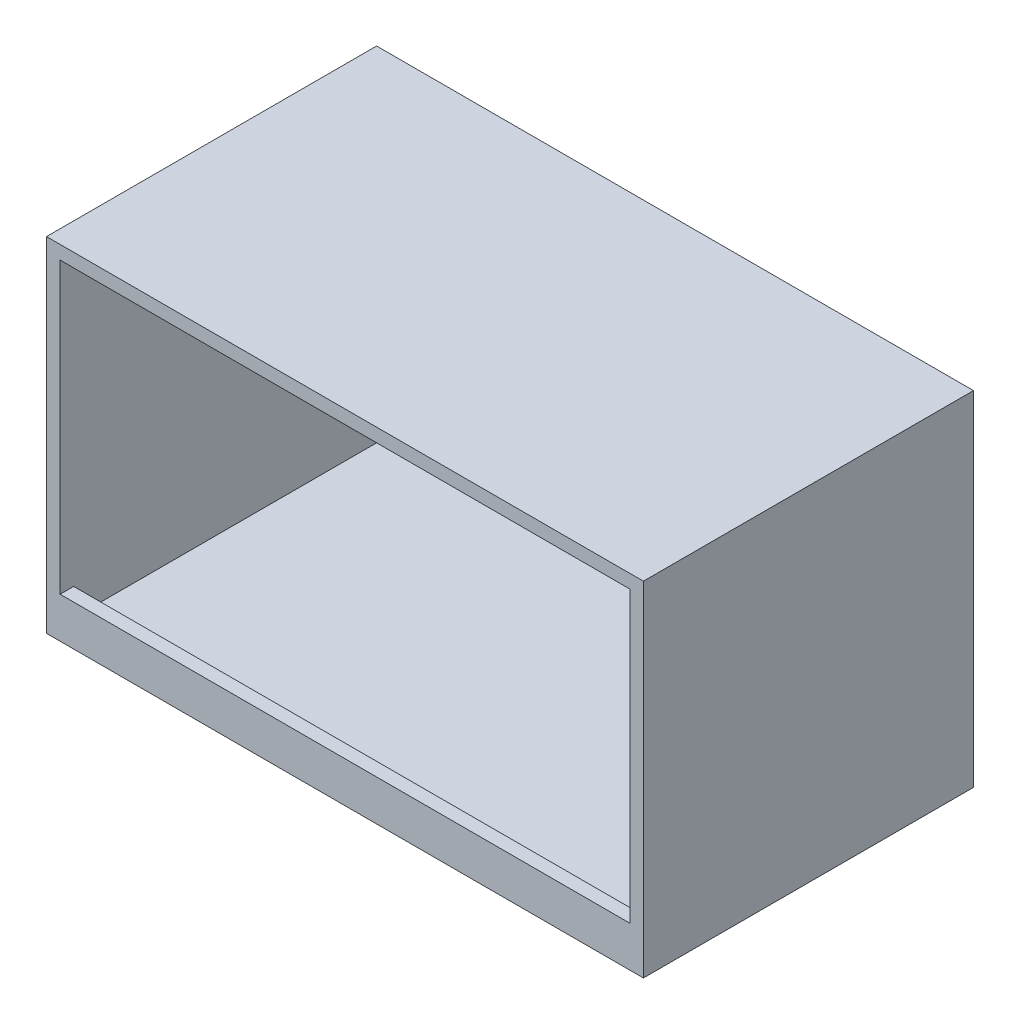
ISO-10303-21;
HEADER;
FILE_DESCRIPTION(('STEP AP214'),'2;1');
FILE_NAME('part.step','',(''),(''),'','','');
FILE_SCHEMA(('AUTOMOTIVE_DESIGN { 1 0 10303 214 1 1 1 1 }'));
ENDSEC;
DATA;
#1=APPLICATION_CONTEXT('core data for automotive mechanical design processes');
#2=APPLICATION_PROTOCOL_DEFINITION('international standard','automotive_design',2000,#1);
#3=PRODUCT_CONTEXT('',#1,'mechanical');
#4=PRODUCT('Part','Part','',(#3));
#5=PRODUCT_RELATED_PRODUCT_CATEGORY('part','',(#4));
#6=PRODUCT_DEFINITION_FORMATION('','',#4);
#7=PRODUCT_DEFINITION_CONTEXT('part definition',#1,'design');
#8=PRODUCT_DEFINITION('design','',#6,#7);
#9=PRODUCT_DEFINITION_SHAPE('','',#8);
#10=(LENGTH_UNIT() NAMED_UNIT(*) SI_UNIT(.MILLI.,.METRE.));
#11=(NAMED_UNIT(*) PLANE_ANGLE_UNIT() SI_UNIT($,.RADIAN.));
#12=(NAMED_UNIT(*) SI_UNIT($,.STERADIAN.) SOLID_ANGLE_UNIT());
#13=UNCERTAINTY_MEASURE_WITH_UNIT(LENGTH_MEASURE(1.E-05),#10,'distance_accuracy_value','');
#14=(GEOMETRIC_REPRESENTATION_CONTEXT(3) GLOBAL_UNCERTAINTY_ASSIGNED_CONTEXT((#13)) GLOBAL_UNIT_ASSIGNED_CONTEXT((#10,
#11,#12)) REPRESENTATION_CONTEXT('',''));
#15=CARTESIAN_POINT('',(0.,0.,0.));
#16=DIRECTION('',(0.,0.,1.));
#17=DIRECTION('',(1.,0.,0.));
#18=AXIS2_PLACEMENT_3D('',#15,#16,#17);
#19=CARTESIAN_POINT('',(64.5,-36.5,36.5));
#20=DIRECTION('',(0.,1.,0.));
#21=DIRECTION('',(-1.,0.,0.));
#22=AXIS2_PLACEMENT_3D('',#19,#20,#21);
#23=PLANE('',#22);
#24=DIRECTION('',(0.,0.,-1.));
#25=VECTOR('',#24,1.);
#26=CARTESIAN_POINT('',(1.5,-36.5,36.5));
#27=LINE('',#26,#25);
#28=CARTESIAN_POINT('',(1.5,-36.5,32.));
#29=VERTEX_POINT('',#28);
#30=CARTESIAN_POINT('',(1.5,-36.5,1.5));
#31=VERTEX_POINT('',#30);
#32=EDGE_CURVE('E134',#29,#31,#27,.T.);
#33=ORIENTED_EDGE('',*,*,#32,.F.);
#34=DIRECTION('',(-1.,0.,0.));
#35=VECTOR('',#34,1.);
#36=CARTESIAN_POINT('',(64.5,-36.5,32.));
#37=LINE('',#36,#35);
#38=CARTESIAN_POINT('',(64.5,-36.5,32.));
#39=VERTEX_POINT('',#38);
#40=EDGE_CURVE('E43',#29,#39,#37,.F.);
#41=ORIENTED_EDGE('',*,*,#40,.T.);
#42=DIRECTION('',(0.,0.,-1.));
#43=VECTOR('',#42,1.);
#44=CARTESIAN_POINT('',(64.5,-36.5,36.5));
#45=LINE('',#44,#43);
#46=CARTESIAN_POINT('',(64.5,-36.5,1.5));
#47=VERTEX_POINT('',#46);
#48=EDGE_CURVE('E155',#39,#47,#45,.T.);
#49=ORIENTED_EDGE('',*,*,#48,.T.);
#50=DIRECTION('',(1.,0.,0.));
#51=VECTOR('',#50,1.);
#52=CARTESIAN_POINT('',(64.5,-36.5,1.5));
#53=LINE('',#52,#51);
#54=EDGE_CURVE('E141',#31,#47,#53,.T.);
#55=ORIENTED_EDGE('',*,*,#54,.F.);
#56=EDGE_LOOP('',(#33,#41,#49,#55));
#57=FACE_BOUND('',#56,.T.);
#58=ADVANCED_FACE('F35',(#57),#23,.T.);
#59=CARTESIAN_POINT('',(64.5,-36.5,36.5));
#60=DIRECTION('',(-1.,0.,0.));
#61=DIRECTION('',(0.,0.,1.));
#62=AXIS2_PLACEMENT_3D('',#59,#60,#61);
#63=PLANE('',#62);
#64=ORIENTED_EDGE('',*,*,#48,.F.);
#65=CARTESIAN_POINT('',(64.5,-33.5,32.));
#66=DIRECTION('',(-1.,0.,0.));
#67=DIRECTION('',(0.,0.,1.));
#68=AXIS2_PLACEMENT_3D('',#65,#66,#67);
#69=CIRCLE('',#68,3.);
#70=CARTESIAN_POINT('',(64.5,-33.5,35.));
#71=VERTEX_POINT('',#70);
#72=EDGE_CURVE('E11',#39,#71,#69,.T.);
#73=ORIENTED_EDGE('',*,*,#72,.T.);
#74=DIRECTION('',(0.,0.,-1.));
#75=VECTOR('',#74,1.);
#76=CARTESIAN_POINT('',(64.5,-33.5,36.5));
#77=LINE('',#76,#75);
#78=CARTESIAN_POINT('',(64.5,-33.5,36.5));
#79=VERTEX_POINT('',#78);
#80=EDGE_CURVE('E121',#79,#71,#77,.T.);
#81=ORIENTED_EDGE('',*,*,#80,.F.);
#82=DIRECTION('',(0.,1.,0.));
#83=VECTOR('',#82,1.);
#84=CARTESIAN_POINT('',(64.5,-36.5,36.5));
#85=LINE('',#84,#83);
#86=CARTESIAN_POINT('',(64.5,-1.5,36.5));
#87=VERTEX_POINT('',#86);
#88=EDGE_CURVE('E117',#79,#87,#85,.T.);
#89=ORIENTED_EDGE('',*,*,#88,.T.);
#90=DIRECTION('',(0.,0.,-1.));
#91=VECTOR('',#90,1.);
#92=CARTESIAN_POINT('',(64.5,-1.5,36.5));
#93=LINE('',#92,#91);
#94=CARTESIAN_POINT('',(64.5,-1.5,1.5));
#95=VERTEX_POINT('',#94);
#96=EDGE_CURVE('E152',#87,#95,#93,.T.);
#97=ORIENTED_EDGE('',*,*,#96,.T.);
#98=DIRECTION('',(0.,1.,0.));
#99=VECTOR('',#98,1.);
#100=CARTESIAN_POINT('',(64.5,-36.5,1.5));
#101=LINE('',#100,#99);
#102=EDGE_CURVE('E144',#47,#95,#101,.T.);
#103=ORIENTED_EDGE('',*,*,#102,.F.);
#104=EDGE_LOOP('',(#64,#73,#81,#89,#97,#103));
#105=FACE_BOUND('',#104,.T.);
#106=ADVANCED_FACE('F221',(#105),#63,.T.);
#107=CARTESIAN_POINT('',(1.5,-36.5,36.5));
#108=DIRECTION('',(1.,0.,0.));
#109=DIRECTION('',(0.,1.,0.));
#110=AXIS2_PLACEMENT_3D('',#107,#108,#109);
#111=PLANE('',#110);
#112=DIRECTION('',(0.,0.,1.));
#113=VECTOR('',#112,1.);
#114=CARTESIAN_POINT('',(1.5,-33.5,36.5));
#115=LINE('',#114,#113);
#116=CARTESIAN_POINT('',(1.5,-33.5,35.));
#117=VERTEX_POINT('',#116);
#118=CARTESIAN_POINT('',(1.5,-33.5,36.5));
#119=VERTEX_POINT('',#118);
#120=EDGE_CURVE('E122',#117,#119,#115,.T.);
#121=ORIENTED_EDGE('',*,*,#120,.F.);
#122=CARTESIAN_POINT('',(1.5,-33.5,32.));
#123=DIRECTION('',(1.,0.,0.));
#124=DIRECTION('',(0.,1.,0.));
#125=AXIS2_PLACEMENT_3D('',#122,#123,#124);
#126=CIRCLE('',#125,3.);
#127=EDGE_CURVE('E57',#117,#29,#126,.T.);
#128=ORIENTED_EDGE('',*,*,#127,.T.);
#129=ORIENTED_EDGE('',*,*,#32,.T.);
#130=DIRECTION('',(0.,-1.,0.));
#131=VECTOR('',#130,1.);
#132=CARTESIAN_POINT('',(1.5,-36.5,1.5));
#133=LINE('',#132,#131);
#134=CARTESIAN_POINT('',(1.5,-1.5,1.5));
#135=VERTEX_POINT('',#134);
#136=EDGE_CURVE('E148',#135,#31,#133,.T.);
#137=ORIENTED_EDGE('',*,*,#136,.F.);
#138=DIRECTION('',(0.,0.,-1.));
#139=VECTOR('',#138,1.);
#140=CARTESIAN_POINT('',(1.5,-1.5,36.5));
#141=LINE('',#140,#139);
#142=CARTESIAN_POINT('',(1.5,-1.5,36.5));
#143=VERTEX_POINT('',#142);
#144=EDGE_CURVE('E132',#143,#135,#141,.T.);
#145=ORIENTED_EDGE('',*,*,#144,.F.);
#146=DIRECTION('',(0.,-1.,0.));
#147=VECTOR('',#146,1.);
#148=CARTESIAN_POINT('',(1.5,-36.5,36.5));
#149=LINE('',#148,#147);
#150=EDGE_CURVE('E116',#143,#119,#149,.T.);
#151=ORIENTED_EDGE('',*,*,#150,.T.);
#152=EDGE_LOOP('',(#121,#128,#129,#137,#145,#151));
#153=FACE_BOUND('',#152,.T.);
#154=ADVANCED_FACE('F129',(#153),#111,.T.);
#155=CARTESIAN_POINT('',(0.,0.,1.5));
#156=DIRECTION('',(1.,0.,0.));
#157=DIRECTION('',(0.,1.,0.));
#158=AXIS2_PLACEMENT_3D('',#155,#156,#157);
#159=PLANE('',#158);
#160=DIRECTION('',(0.,-1.,0.));
#161=VECTOR('',#160,1.);
#162=CARTESIAN_POINT('',(0.,0.,0.));
#163=LINE('',#162,#161);
#164=CARTESIAN_POINT('',(0.,0.,0.));
#165=VERTEX_POINT('',#164);
#166=CARTESIAN_POINT('',(0.,-38.,0.));
#167=VERTEX_POINT('',#166);
#168=EDGE_CURVE('E169',#165,#167,#163,.T.);
#169=ORIENTED_EDGE('',*,*,#168,.T.);
#170=DIRECTION('',(0.,0.,-1.));
#171=VECTOR('',#170,1.);
#172=CARTESIAN_POINT('',(0.,-38.,1.5));
#173=LINE('',#172,#171);
#174=CARTESIAN_POINT('',(0.,-38.,36.5));
#175=VERTEX_POINT('',#174);
#176=EDGE_CURVE('E187',#175,#167,#173,.T.);
#177=ORIENTED_EDGE('',*,*,#176,.F.);
#178=DIRECTION('',(0.,-1.,0.));
#179=VECTOR('',#178,1.);
#180=CARTESIAN_POINT('',(0.,-38.,36.5));
#181=LINE('',#180,#179);
#182=CARTESIAN_POINT('',(0.,0.,36.5));
#183=VERTEX_POINT('',#182);
#184=EDGE_CURVE('E163',#183,#175,#181,.T.);
#185=ORIENTED_EDGE('',*,*,#184,.F.);
#186=DIRECTION('',(0.,0.,-1.));
#187=VECTOR('',#186,1.);
#188=CARTESIAN_POINT('',(0.,0.,1.5));
#189=LINE('',#188,#187);
#190=EDGE_CURVE('E178',#183,#165,#189,.T.);
#191=ORIENTED_EDGE('',*,*,#190,.T.);
#192=EDGE_LOOP('',(#169,#177,#185,#191));
#193=FACE_BOUND('',#192,.T.);
#194=ADVANCED_FACE('F196',(#193),#159,.F.);
#195=CARTESIAN_POINT('',(0.,-38.,1.5));
#196=DIRECTION('',(0.,1.,0.));
#197=DIRECTION('',(0.,0.,1.));
#198=AXIS2_PLACEMENT_3D('',#195,#196,#197);
#199=PLANE('',#198);
#200=DIRECTION('',(1.,0.,0.));
#201=VECTOR('',#200,1.);
#202=CARTESIAN_POINT('',(0.,-38.,0.));
#203=LINE('',#202,#201);
#204=CARTESIAN_POINT('',(66.,-38.,0.));
#205=VERTEX_POINT('',#204);
#206=EDGE_CURVE('E172',#167,#205,#203,.T.);
#207=ORIENTED_EDGE('',*,*,#206,.T.);
#208=DIRECTION('',(0.,0.,-1.));
#209=VECTOR('',#208,1.);
#210=CARTESIAN_POINT('',(66.,-38.,1.5));
#211=LINE('',#210,#209);
#212=CARTESIAN_POINT('',(66.,-38.,36.5));
#213=VERTEX_POINT('',#212);
#214=EDGE_CURVE('E184',#213,#205,#211,.T.);
#215=ORIENTED_EDGE('',*,*,#214,.F.);
#216=DIRECTION('',(1.,0.,0.));
#217=VECTOR('',#216,1.);
#218=CARTESIAN_POINT('',(66.,-38.,36.5));
#219=LINE('',#218,#217);
#220=EDGE_CURVE('E166',#175,#213,#219,.T.);
#221=ORIENTED_EDGE('',*,*,#220,.F.);
#222=ORIENTED_EDGE('',*,*,#176,.T.);
#223=EDGE_LOOP('',(#207,#215,#221,#222));
#224=FACE_BOUND('',#223,.T.);
#225=ADVANCED_FACE('F192',(#224),#199,.F.);
#226=CARTESIAN_POINT('',(66.,0.,1.5));
#227=DIRECTION('',(-1.,0.,0.));
#228=DIRECTION('',(0.,-1.,0.));
#229=AXIS2_PLACEMENT_3D('',#226,#227,#228);
#230=PLANE('',#229);
#231=DIRECTION('',(0.,1.,0.));
#232=VECTOR('',#231,1.);
#233=CARTESIAN_POINT('',(66.,0.,0.));
#234=LINE('',#233,#232);
#235=CARTESIAN_POINT('',(66.,0.,0.));
#236=VERTEX_POINT('',#235);
#237=EDGE_CURVE('E174',#205,#236,#234,.T.);
#238=ORIENTED_EDGE('',*,*,#237,.T.);
#239=DIRECTION('',(0.,0.,-1.));
#240=VECTOR('',#239,1.);
#241=CARTESIAN_POINT('',(66.,0.,1.5));
#242=LINE('',#241,#240);
#243=CARTESIAN_POINT('',(66.,0.,36.5));
#244=VERTEX_POINT('',#243);
#245=EDGE_CURVE('E181',#244,#236,#242,.T.);
#246=ORIENTED_EDGE('',*,*,#245,.F.);
#247=DIRECTION('',(0.,1.,0.));
#248=VECTOR('',#247,1.);
#249=CARTESIAN_POINT('',(66.,-38.,36.5));
#250=LINE('',#249,#248);
#251=EDGE_CURVE('E157',#213,#244,#250,.T.);
#252=ORIENTED_EDGE('',*,*,#251,.F.);
#253=ORIENTED_EDGE('',*,*,#214,.T.);
#254=EDGE_LOOP('',(#238,#246,#252,#253));
#255=FACE_BOUND('',#254,.T.);
#256=ADVANCED_FACE('F202',(#255),#230,.F.);
#257=CARTESIAN_POINT('',(0.,0.,1.5));
#258=DIRECTION('',(0.,-1.,0.));
#259=DIRECTION('',(0.,0.,-1.));
#260=AXIS2_PLACEMENT_3D('',#257,#258,#259);
#261=PLANE('',#260);
#262=DIRECTION('',(-1.,0.,0.));
#263=VECTOR('',#262,1.);
#264=CARTESIAN_POINT('',(0.,0.,0.));
#265=LINE('',#264,#263);
#266=EDGE_CURVE('E176',#236,#165,#265,.T.);
#267=ORIENTED_EDGE('',*,*,#266,.T.);
#268=ORIENTED_EDGE('',*,*,#190,.F.);
#269=DIRECTION('',(-1.,0.,0.));
#270=VECTOR('',#269,1.);
#271=CARTESIAN_POINT('',(66.,0.,36.5));
#272=LINE('',#271,#270);
#273=EDGE_CURVE('E160',#244,#183,#272,.T.);
#274=ORIENTED_EDGE('',*,*,#273,.F.);
#275=ORIENTED_EDGE('',*,*,#245,.T.);
#276=EDGE_LOOP('',(#267,#268,#274,#275));
#277=FACE_BOUND('',#276,.T.);
#278=ADVANCED_FACE('F206',(#277),#261,.F.);
#279=CARTESIAN_POINT('',(0.,0.,0.));
#280=DIRECTION('',(0.,0.,1.));
#281=DIRECTION('',(1.,0.,0.));
#282=AXIS2_PLACEMENT_3D('',#279,#280,#281);
#283=PLANE('',#282);
#284=ORIENTED_EDGE('',*,*,#168,.F.);
#285=ORIENTED_EDGE('',*,*,#266,.F.);
#286=ORIENTED_EDGE('',*,*,#237,.F.);
#287=ORIENTED_EDGE('',*,*,#206,.F.);
#288=EDGE_LOOP('',(#284,#285,#286,#287));
#289=FACE_BOUND('',#288,.T.);
#290=ADVANCED_FACE('F199',(#289),#283,.F.);
#291=CARTESIAN_POINT('',(0.,0.,36.5));
#292=DIRECTION('',(0.,0.,1.));
#293=DIRECTION('',(1.,0.,0.));
#294=AXIS2_PLACEMENT_3D('',#291,#292,#293);
#295=PLANE('',#294);
#296=ORIENTED_EDGE('',*,*,#88,.F.);
#297=DIRECTION('',(1.,0.,0.));
#298=VECTOR('',#297,1.);
#299=CARTESIAN_POINT('',(1.5,-33.5,36.5));
#300=LINE('',#299,#298);
#301=EDGE_CURVE('E110',#119,#79,#300,.T.);
#302=ORIENTED_EDGE('',*,*,#301,.F.);
#303=ORIENTED_EDGE('',*,*,#150,.F.);
#304=DIRECTION('',(-1.,0.,0.));
#305=VECTOR('',#304,1.);
#306=CARTESIAN_POINT('',(64.5,-1.5,36.5));
#307=LINE('',#306,#305);
#308=EDGE_CURVE('E135',#87,#143,#307,.T.);
#309=ORIENTED_EDGE('',*,*,#308,.F.);
#310=EDGE_LOOP('',(#296,#302,#303,#309));
#311=FACE_BOUND('',#310,.T.);
#312=ORIENTED_EDGE('',*,*,#251,.T.);
#313=ORIENTED_EDGE('',*,*,#273,.T.);
#314=ORIENTED_EDGE('',*,*,#184,.T.);
#315=ORIENTED_EDGE('',*,*,#220,.T.);
#316=EDGE_LOOP('',(#312,#313,#314,#315));
#317=FACE_BOUND('',#316,.T.);
#318=ADVANCED_FACE('F112',(#311,#317),#295,.T.);
#319=CARTESIAN_POINT('',(64.5,-1.5,36.5));
#320=DIRECTION('',(0.,-1.,0.));
#321=DIRECTION('',(1.,0.,0.));
#322=AXIS2_PLACEMENT_3D('',#319,#320,#321);
#323=PLANE('',#322);
#324=DIRECTION('',(-1.,0.,0.));
#325=VECTOR('',#324,1.);
#326=CARTESIAN_POINT('',(64.5,-1.5,1.5));
#327=LINE('',#326,#325);
#328=EDGE_CURVE('E146',#95,#135,#327,.T.);
#329=ORIENTED_EDGE('',*,*,#328,.F.);
#330=ORIENTED_EDGE('',*,*,#96,.F.);
#331=ORIENTED_EDGE('',*,*,#308,.T.);
#332=ORIENTED_EDGE('',*,*,#144,.T.);
#333=EDGE_LOOP('',(#329,#330,#331,#332));
#334=FACE_BOUND('',#333,.T.);
#335=ADVANCED_FACE('F208',(#334),#323,.T.);
#336=CARTESIAN_POINT('',(0.,0.,1.5));
#337=DIRECTION('',(0.,0.,1.));
#338=DIRECTION('',(1.,0.,0.));
#339=AXIS2_PLACEMENT_3D('',#336,#337,#338);
#340=PLANE('',#339);
#341=ORIENTED_EDGE('',*,*,#54,.T.);
#342=ORIENTED_EDGE('',*,*,#102,.T.);
#343=ORIENTED_EDGE('',*,*,#328,.T.);
#344=ORIENTED_EDGE('',*,*,#136,.T.);
#345=EDGE_LOOP('',(#341,#342,#343,#344));
#346=FACE_BOUND('',#345,.T.);
#347=ADVANCED_FACE('F214',(#346),#340,.T.);
#348=CARTESIAN_POINT('',(0.,-33.5,0.));
#349=DIRECTION('',(0.,-1.,0.));
#350=DIRECTION('',(1.,0.,0.));
#351=AXIS2_PLACEMENT_3D('',#348,#349,#350);
#352=PLANE('',#351);
#353=ORIENTED_EDGE('',*,*,#120,.T.);
#354=ORIENTED_EDGE('',*,*,#301,.T.);
#355=ORIENTED_EDGE('',*,*,#80,.T.);
#356=DIRECTION('',(-1.,0.,0.));
#357=VECTOR('',#356,1.);
#358=CARTESIAN_POINT('',(1.5,-33.5,35.));
#359=LINE('',#358,#357);
#360=EDGE_CURVE('E127',#71,#117,#359,.T.);
#361=ORIENTED_EDGE('',*,*,#360,.T.);
#362=EDGE_LOOP('',(#353,#354,#355,#361));
#363=FACE_BOUND('',#362,.T.);
#364=ADVANCED_FACE('F125',(#363),#352,.F.);
#365=CARTESIAN_POINT('',(1.5,-33.5,32.));
#366=DIRECTION('',(-1.,0.,0.));
#367=DIRECTION('',(0.,-1.,0.));
#368=AXIS2_PLACEMENT_3D('',#365,#366,#367);
#369=CYLINDRICAL_SURFACE('',#368,3.);
#370=ORIENTED_EDGE('',*,*,#72,.F.);
#371=ORIENTED_EDGE('',*,*,#40,.F.);
#372=ORIENTED_EDGE('',*,*,#127,.F.);
#373=ORIENTED_EDGE('',*,*,#360,.F.);
#374=EDGE_LOOP('',(#370,#371,#372,#373));
#375=FACE_BOUND('',#374,.T.);
#376=ADVANCED_FACE('F37',(#375),#369,.F.);
#377=CLOSED_SHELL('',(#58,#106,#154,#194,#225,#256,#278,#290,#318,#335,#347,#364,#376));
#378=MANIFOLD_SOLID_BREP('B2',#377);
#379=ADVANCED_BREP_SHAPE_REPRESENTATION('',(#18,#378),#14);
#380=SHAPE_DEFINITION_REPRESENTATION(#9,#379);
ENDSEC;
END-ISO-10303-21;
